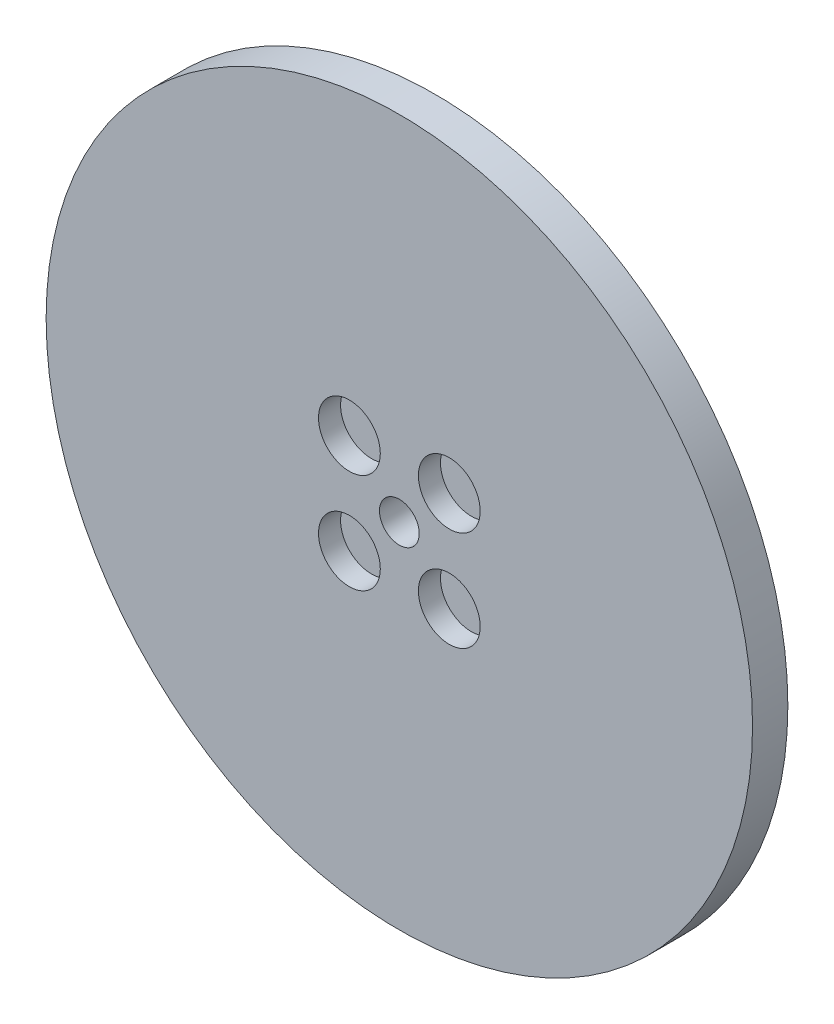
ISO-10303-21;
HEADER;
FILE_DESCRIPTION(('STEP AP214'),'2;1');
FILE_NAME('part.step','',(''),(''),'','','');
FILE_SCHEMA(('AUTOMOTIVE_DESIGN { 1 0 10303 214 1 1 1 1 }'));
ENDSEC;
DATA;
#1=APPLICATION_CONTEXT('core data for automotive mechanical design processes');
#2=APPLICATION_PROTOCOL_DEFINITION('international standard','automotive_design',2000,#1);
#3=PRODUCT_CONTEXT('',#1,'mechanical');
#4=PRODUCT('Part','Part','',(#3));
#5=PRODUCT_RELATED_PRODUCT_CATEGORY('part','',(#4));
#6=PRODUCT_DEFINITION_FORMATION('','',#4);
#7=PRODUCT_DEFINITION_CONTEXT('part definition',#1,'design');
#8=PRODUCT_DEFINITION('design','',#6,#7);
#9=PRODUCT_DEFINITION_SHAPE('','',#8);
#10=(LENGTH_UNIT() NAMED_UNIT(*) SI_UNIT(.MILLI.,.METRE.));
#11=(NAMED_UNIT(*) PLANE_ANGLE_UNIT() SI_UNIT($,.RADIAN.));
#12=(NAMED_UNIT(*) SI_UNIT($,.STERADIAN.) SOLID_ANGLE_UNIT());
#13=UNCERTAINTY_MEASURE_WITH_UNIT(LENGTH_MEASURE(1.E-05),#10,'distance_accuracy_value','');
#14=(GEOMETRIC_REPRESENTATION_CONTEXT(3) GLOBAL_UNCERTAINTY_ASSIGNED_CONTEXT((#13)) GLOBAL_UNIT_ASSIGNED_CONTEXT((#10,
#11,#12)) REPRESENTATION_CONTEXT('',''));
#15=CARTESIAN_POINT('',(0.,0.,0.));
#16=DIRECTION('',(0.,0.,1.));
#17=DIRECTION('',(1.,0.,0.));
#18=AXIS2_PLACEMENT_3D('',#15,#16,#17);
#19=CARTESIAN_POINT('',(5.65599974191923,-5.65770862800566,8.));
#20=DIRECTION('',(0.,0.,-1.));
#21=DIRECTION('',(-1.,0.,0.));
#22=AXIS2_PLACEMENT_3D('',#19,#20,#21);
#23=CYLINDRICAL_SURFACE('',#22,1.5);
#24=CARTESIAN_POINT('',(5.65599974191923,-5.65770862800566,4.));
#25=DIRECTION('',(0.,0.,1.));
#26=DIRECTION('',(1.,0.,0.));
#27=AXIS2_PLACEMENT_3D('',#24,#25,#26);
#28=CIRCLE('',#27,1.5);
#29=CARTESIAN_POINT('',(7.15599974191923,-5.65770862800566,4.));
#30=VERTEX_POINT('',#29);
#31=EDGE_CURVE('E159',#30,#30,#28,.T.);
#32=ORIENTED_EDGE('',*,*,#31,.F.);
#33=EDGE_LOOP('',(#32));
#34=FACE_BOUND('',#33,.T.);
#35=CARTESIAN_POINT('',(5.65599974191923,-5.65770862800566,5.3));
#36=DIRECTION('',(0.,0.,1.));
#37=DIRECTION('',(1.,0.,0.));
#38=AXIS2_PLACEMENT_3D('',#35,#36,#37);
#39=CIRCLE('',#38,1.5);
#40=CARTESIAN_POINT('',(7.15599974191923,-5.65770862800566,5.3));
#41=VERTEX_POINT('',#40);
#42=EDGE_CURVE('E43',#41,#41,#39,.T.);
#43=ORIENTED_EDGE('',*,*,#42,.T.);
#44=EDGE_LOOP('',(#43));
#45=FACE_BOUND('',#44,.T.);
#46=ADVANCED_FACE('F39',(#34,#45),#23,.F.);
#47=CARTESIAN_POINT('',(-5.65599974191923,-5.65770862800566,8.));
#48=DIRECTION('',(0.,0.,-1.));
#49=DIRECTION('',(-1.,0.,0.));
#50=AXIS2_PLACEMENT_3D('',#47,#48,#49);
#51=CYLINDRICAL_SURFACE('',#50,1.5);
#52=CARTESIAN_POINT('',(-5.65599974191923,-5.65770862800566,4.));
#53=DIRECTION('',(0.,0.,1.));
#54=DIRECTION('',(1.,0.,0.));
#55=AXIS2_PLACEMENT_3D('',#52,#53,#54);
#56=CIRCLE('',#55,1.5);
#57=CARTESIAN_POINT('',(-4.15599974191923,-5.65770862800566,4.));
#58=VERTEX_POINT('',#57);
#59=EDGE_CURVE('E156',#58,#58,#56,.T.);
#60=ORIENTED_EDGE('',*,*,#59,.F.);
#61=EDGE_LOOP('',(#60));
#62=FACE_BOUND('',#61,.T.);
#63=CARTESIAN_POINT('',(-5.65599974191923,-5.65770862800566,5.3));
#64=DIRECTION('',(0.,0.,1.));
#65=DIRECTION('',(1.,0.,0.));
#66=AXIS2_PLACEMENT_3D('',#63,#64,#65);
#67=CIRCLE('',#66,1.5);
#68=CARTESIAN_POINT('',(-4.15599974191923,-5.65770862800566,5.3));
#69=VERTEX_POINT('',#68);
#70=EDGE_CURVE('E63',#69,#69,#67,.T.);
#71=ORIENTED_EDGE('',*,*,#70,.T.);
#72=EDGE_LOOP('',(#71));
#73=FACE_BOUND('',#72,.T.);
#74=ADVANCED_FACE('F82',(#62,#73),#51,.F.);
#75=CARTESIAN_POINT('',(5.65599974191923,5.65770862800566,8.));
#76=DIRECTION('',(0.,0.,-1.));
#77=DIRECTION('',(-1.,0.,0.));
#78=AXIS2_PLACEMENT_3D('',#75,#76,#77);
#79=CYLINDRICAL_SURFACE('',#78,1.5);
#80=CARTESIAN_POINT('',(5.65599974191923,5.65770862800566,4.));
#81=DIRECTION('',(0.,0.,1.));
#82=DIRECTION('',(1.,0.,0.));
#83=AXIS2_PLACEMENT_3D('',#80,#81,#82);
#84=CIRCLE('',#83,1.5);
#85=CARTESIAN_POINT('',(7.15599974191923,5.65770862800566,4.));
#86=VERTEX_POINT('',#85);
#87=EDGE_CURVE('E162',#86,#86,#84,.T.);
#88=ORIENTED_EDGE('',*,*,#87,.F.);
#89=EDGE_LOOP('',(#88));
#90=FACE_BOUND('',#89,.T.);
#91=CARTESIAN_POINT('',(5.65599974191923,5.65770862800566,5.3));
#92=DIRECTION('',(0.,0.,1.));
#93=DIRECTION('',(1.,0.,0.));
#94=AXIS2_PLACEMENT_3D('',#91,#92,#93);
#95=CIRCLE('',#94,1.5);
#96=CARTESIAN_POINT('',(7.15599974191923,5.65770862800566,5.3));
#97=VERTEX_POINT('',#96);
#98=EDGE_CURVE('E61',#97,#97,#95,.T.);
#99=ORIENTED_EDGE('',*,*,#98,.T.);
#100=EDGE_LOOP('',(#99));
#101=FACE_BOUND('',#100,.T.);
#102=ADVANCED_FACE('F89',(#90,#101),#79,.F.);
#103=CARTESIAN_POINT('',(-5.65599974191923,5.65770862800566,8.));
#104=DIRECTION('',(0.,0.,-1.));
#105=DIRECTION('',(-1.,0.,0.));
#106=AXIS2_PLACEMENT_3D('',#103,#104,#105);
#107=CYLINDRICAL_SURFACE('',#106,1.5);
#108=CARTESIAN_POINT('',(-5.65599974191923,5.65770862800566,4.));
#109=DIRECTION('',(0.,0.,1.));
#110=DIRECTION('',(1.,0.,0.));
#111=AXIS2_PLACEMENT_3D('',#108,#109,#110);
#112=CIRCLE('',#111,1.5);
#113=CARTESIAN_POINT('',(-4.15599974191923,5.65770862800566,4.));
#114=VERTEX_POINT('',#113);
#115=EDGE_CURVE('E151',#114,#114,#112,.T.);
#116=ORIENTED_EDGE('',*,*,#115,.F.);
#117=EDGE_LOOP('',(#116));
#118=FACE_BOUND('',#117,.T.);
#119=CARTESIAN_POINT('',(-5.65599974191923,5.65770862800566,5.3));
#120=DIRECTION('',(0.,0.,1.));
#121=DIRECTION('',(1.,0.,0.));
#122=AXIS2_PLACEMENT_3D('',#119,#120,#121);
#123=CIRCLE('',#122,1.5);
#124=CARTESIAN_POINT('',(-4.15599974191923,5.65770862800566,5.3));
#125=VERTEX_POINT('',#124);
#126=EDGE_CURVE('E57',#125,#125,#123,.T.);
#127=ORIENTED_EDGE('',*,*,#126,.T.);
#128=EDGE_LOOP('',(#127));
#129=FACE_BOUND('',#128,.T.);
#130=ADVANCED_FACE('F96',(#118,#129),#107,.F.);
#131=CARTESIAN_POINT('',(0.,0.,0.));
#132=DIRECTION('',(0.,0.,1.));
#133=DIRECTION('',(1.,0.,0.));
#134=AXIS2_PLACEMENT_3D('',#131,#132,#133);
#135=PLANE('',#134);
#136=CARTESIAN_POINT('',(20.,0.,0.));
#137=DIRECTION('',(0.,0.,-1.));
#138=DIRECTION('',(-1.,0.,0.));
#139=AXIS2_PLACEMENT_3D('',#136,#137,#138);
#140=CIRCLE('',#139,5.15);
#141=CARTESIAN_POINT('',(14.85,0.,0.));
#142=VERTEX_POINT('',#141);
#143=EDGE_CURVE('E60',#142,#142,#140,.T.);
#144=ORIENTED_EDGE('',*,*,#143,.F.);
#145=EDGE_LOOP('',(#144));
#146=FACE_BOUND('',#145,.T.);
#147=CARTESIAN_POINT('',(0.,0.,0.));
#148=DIRECTION('',(0.,0.,1.));
#149=DIRECTION('',(1.,0.,0.));
#150=AXIS2_PLACEMENT_3D('',#147,#148,#149);
#151=CIRCLE('',#150,30.);
#152=CARTESIAN_POINT('',(30.,0.,0.));
#153=VERTEX_POINT('',#152);
#154=EDGE_CURVE('E47',#153,#153,#151,.T.);
#155=ORIENTED_EDGE('',*,*,#154,.F.);
#156=EDGE_LOOP('',(#155));
#157=FACE_BOUND('',#156,.T.);
#158=CARTESIAN_POINT('',(0.,0.,0.));
#159=DIRECTION('',(0.,0.,1.));
#160=DIRECTION('',(1.,0.,0.));
#161=AXIS2_PLACEMENT_3D('',#158,#159,#160);
#162=CIRCLE('',#161,12.5);
#163=CARTESIAN_POINT('',(12.5,0.,0.));
#164=VERTEX_POINT('',#163);
#165=EDGE_CURVE('E52',#164,#164,#162,.T.);
#166=ORIENTED_EDGE('',*,*,#165,.T.);
#167=EDGE_LOOP('',(#166));
#168=FACE_BOUND('',#167,.T.);
#169=ADVANCED_FACE('F99',(#146,#157,#168),#135,.F.);
#170=CARTESIAN_POINT('',(0.,0.,4.));
#171=DIRECTION('',(0.,0.,-1.));
#172=DIRECTION('',(-1.,0.,0.));
#173=AXIS2_PLACEMENT_3D('',#170,#171,#172);
#174=CYLINDRICAL_SURFACE('',#173,30.);
#175=CARTESIAN_POINT('',(0.,0.,4.));
#176=DIRECTION('',(0.,0.,1.));
#177=DIRECTION('',(1.,0.,0.));
#178=AXIS2_PLACEMENT_3D('',#175,#176,#177);
#179=CIRCLE('',#178,30.);
#180=CARTESIAN_POINT('',(30.,0.,4.));
#181=VERTEX_POINT('',#180);
#182=EDGE_CURVE('E10',#181,#181,#179,.T.);
#183=ORIENTED_EDGE('',*,*,#182,.F.);
#184=EDGE_LOOP('',(#183));
#185=FACE_BOUND('',#184,.T.);
#186=ORIENTED_EDGE('',*,*,#154,.T.);
#187=EDGE_LOOP('',(#186));
#188=FACE_BOUND('',#187,.T.);
#189=ADVANCED_FACE('F41',(#185,#188),#174,.T.);
#190=CARTESIAN_POINT('',(0.,0.,4.));
#191=DIRECTION('',(0.,0.,-1.));
#192=DIRECTION('',(-1.,0.,0.));
#193=AXIS2_PLACEMENT_3D('',#190,#191,#192);
#194=CYLINDRICAL_SURFACE('',#193,12.5);
#195=CARTESIAN_POINT('',(0.,0.,4.));
#196=DIRECTION('',(0.,0.,1.));
#197=DIRECTION('',(1.,0.,0.));
#198=AXIS2_PLACEMENT_3D('',#195,#196,#197);
#199=CIRCLE('',#198,12.5);
#200=CARTESIAN_POINT('',(12.5,0.,4.));
#201=VERTEX_POINT('',#200);
#202=EDGE_CURVE('E137',#201,#201,#199,.T.);
#203=ORIENTED_EDGE('',*,*,#202,.T.);
#204=EDGE_LOOP('',(#203));
#205=FACE_BOUND('',#204,.T.);
#206=ORIENTED_EDGE('',*,*,#165,.F.);
#207=EDGE_LOOP('',(#206));
#208=FACE_BOUND('',#207,.T.);
#209=ADVANCED_FACE('F118',(#205,#208),#194,.F.);
#210=CARTESIAN_POINT('',(0.,0.,4.));
#211=DIRECTION('',(0.,0.,1.));
#212=DIRECTION('',(1.,0.,0.));
#213=AXIS2_PLACEMENT_3D('',#210,#211,#212);
#214=PLANE('',#213);
#215=ORIENTED_EDGE('',*,*,#87,.T.);
#216=EDGE_LOOP('',(#215));
#217=FACE_BOUND('',#216,.T.);
#218=ORIENTED_EDGE('',*,*,#31,.T.);
#219=EDGE_LOOP('',(#218));
#220=FACE_BOUND('',#219,.T.);
#221=ORIENTED_EDGE('',*,*,#59,.T.);
#222=EDGE_LOOP('',(#221));
#223=FACE_BOUND('',#222,.T.);
#224=ORIENTED_EDGE('',*,*,#115,.T.);
#225=EDGE_LOOP('',(#224));
#226=FACE_BOUND('',#225,.T.);
#227=CARTESIAN_POINT('',(0.,0.,4.));
#228=DIRECTION('',(0.,0.,1.));
#229=DIRECTION('',(1.,0.,0.));
#230=AXIS2_PLACEMENT_3D('',#227,#228,#229);
#231=CIRCLE('',#230,2.25);
#232=CARTESIAN_POINT('',(2.25,0.,4.));
#233=VERTEX_POINT('',#232);
#234=EDGE_CURVE('E148',#233,#233,#231,.T.);
#235=ORIENTED_EDGE('',*,*,#234,.T.);
#236=EDGE_LOOP('',(#235));
#237=FACE_BOUND('',#236,.T.);
#238=ORIENTED_EDGE('',*,*,#202,.F.);
#239=EDGE_LOOP('',(#238));
#240=FACE_BOUND('',#239,.T.);
#241=ADVANCED_FACE('F111',(#217,#220,#223,#226,#237,#240),#214,.F.);
#242=CARTESIAN_POINT('',(0.,0.,8.));
#243=DIRECTION('',(0.,0.,1.));
#244=DIRECTION('',(1.,0.,0.));
#245=AXIS2_PLACEMENT_3D('',#242,#243,#244);
#246=PLANE('',#245);
#247=CARTESIAN_POINT('',(-5.65599974191923,-5.65770862800566,8.));
#248=DIRECTION('',(0.,0.,1.));
#249=DIRECTION('',(1.,0.,0.));
#250=AXIS2_PLACEMENT_3D('',#247,#248,#249);
#251=CIRCLE('',#250,3.5);
#252=CARTESIAN_POINT('',(-2.15599974191923,-5.65770862800566,8.));
#253=VERTEX_POINT('',#252);
#254=EDGE_CURVE('E175',#253,#253,#251,.T.);
#255=ORIENTED_EDGE('',*,*,#254,.F.);
#256=EDGE_LOOP('',(#255));
#257=FACE_BOUND('',#256,.T.);
#258=CARTESIAN_POINT('',(5.65599974191923,-5.65770862800566,8.));
#259=DIRECTION('',(0.,0.,1.));
#260=DIRECTION('',(1.,0.,0.));
#261=AXIS2_PLACEMENT_3D('',#258,#259,#260);
#262=CIRCLE('',#261,3.5);
#263=CARTESIAN_POINT('',(9.15599974191923,-5.65770862800566,8.));
#264=VERTEX_POINT('',#263);
#265=EDGE_CURVE('E182',#264,#264,#262,.T.);
#266=ORIENTED_EDGE('',*,*,#265,.F.);
#267=EDGE_LOOP('',(#266));
#268=FACE_BOUND('',#267,.T.);
#269=CARTESIAN_POINT('',(5.65599974191923,5.65770862800566,8.));
#270=DIRECTION('',(0.,0.,1.));
#271=DIRECTION('',(1.,0.,0.));
#272=AXIS2_PLACEMENT_3D('',#269,#270,#271);
#273=CIRCLE('',#272,3.5);
#274=CARTESIAN_POINT('',(9.15599974191923,5.65770862800566,8.));
#275=VERTEX_POINT('',#274);
#276=EDGE_CURVE('E169',#275,#275,#273,.T.);
#277=ORIENTED_EDGE('',*,*,#276,.F.);
#278=EDGE_LOOP('',(#277));
#279=FACE_BOUND('',#278,.T.);
#280=CARTESIAN_POINT('',(-5.65599974191923,5.65770862800566,8.));
#281=DIRECTION('',(0.,0.,1.));
#282=DIRECTION('',(1.,0.,0.));
#283=AXIS2_PLACEMENT_3D('',#280,#281,#282);
#284=CIRCLE('',#283,3.5);
#285=CARTESIAN_POINT('',(-2.15599974191923,5.65770862800566,8.));
#286=VERTEX_POINT('',#285);
#287=EDGE_CURVE('E166',#286,#286,#284,.T.);
#288=ORIENTED_EDGE('',*,*,#287,.F.);
#289=EDGE_LOOP('',(#288));
#290=FACE_BOUND('',#289,.T.);
#291=CARTESIAN_POINT('',(0.,0.,8.));
#292=DIRECTION('',(0.,0.,1.));
#293=DIRECTION('',(1.,0.,0.));
#294=AXIS2_PLACEMENT_3D('',#291,#292,#293);
#295=CIRCLE('',#294,40.);
#296=CARTESIAN_POINT('',(40.,0.,8.));
#297=VERTEX_POINT('',#296);
#298=EDGE_CURVE('E139',#297,#297,#295,.T.);
#299=ORIENTED_EDGE('',*,*,#298,.T.);
#300=EDGE_LOOP('',(#299));
#301=FACE_BOUND('',#300,.T.);
#302=CARTESIAN_POINT('',(0.,0.,8.));
#303=DIRECTION('',(0.,0.,1.));
#304=DIRECTION('',(1.,0.,0.));
#305=AXIS2_PLACEMENT_3D('',#302,#303,#304);
#306=CIRCLE('',#305,2.25);
#307=CARTESIAN_POINT('',(2.25,0.,8.));
#308=VERTEX_POINT('',#307);
#309=EDGE_CURVE('E146',#308,#308,#306,.T.);
#310=ORIENTED_EDGE('',*,*,#309,.F.);
#311=EDGE_LOOP('',(#310));
#312=FACE_BOUND('',#311,.T.);
#313=ADVANCED_FACE('F107',(#257,#268,#279,#290,#301,#312),#246,.T.);
#314=ORIENTED_EDGE('',*,*,#182,.T.);
#315=EDGE_LOOP('',(#314));
#316=FACE_BOUND('',#315,.T.);
#317=CARTESIAN_POINT('',(0.,0.,4.));
#318=DIRECTION('',(0.,0.,1.));
#319=DIRECTION('',(1.,0.,0.));
#320=AXIS2_PLACEMENT_3D('',#317,#318,#319);
#321=CIRCLE('',#320,40.);
#322=CARTESIAN_POINT('',(40.,0.,4.));
#323=VERTEX_POINT('',#322);
#324=EDGE_CURVE('E142',#323,#323,#321,.T.);
#325=ORIENTED_EDGE('',*,*,#324,.F.);
#326=EDGE_LOOP('',(#325));
#327=FACE_BOUND('',#326,.T.);
#328=ADVANCED_FACE('F110',(#316,#327),#214,.F.);
#329=CARTESIAN_POINT('',(0.,0.,8.));
#330=DIRECTION('',(0.,0.,-1.));
#331=DIRECTION('',(-1.,0.,0.));
#332=AXIS2_PLACEMENT_3D('',#329,#330,#331);
#333=CYLINDRICAL_SURFACE('',#332,40.);
#334=ORIENTED_EDGE('',*,*,#298,.F.);
#335=EDGE_LOOP('',(#334));
#336=FACE_BOUND('',#335,.T.);
#337=ORIENTED_EDGE('',*,*,#324,.T.);
#338=EDGE_LOOP('',(#337));
#339=FACE_BOUND('',#338,.T.);
#340=ADVANCED_FACE('F105',(#336,#339),#333,.T.);
#341=CARTESIAN_POINT('',(0.,0.,8.));
#342=DIRECTION('',(0.,0.,-1.));
#343=DIRECTION('',(-1.,0.,0.));
#344=AXIS2_PLACEMENT_3D('',#341,#342,#343);
#345=CYLINDRICAL_SURFACE('',#344,2.25);
#346=ORIENTED_EDGE('',*,*,#309,.T.);
#347=EDGE_LOOP('',(#346));
#348=FACE_BOUND('',#347,.T.);
#349=ORIENTED_EDGE('',*,*,#234,.F.);
#350=EDGE_LOOP('',(#349));
#351=FACE_BOUND('',#350,.T.);
#352=ADVANCED_FACE('F101',(#348,#351),#345,.F.);
#353=CARTESIAN_POINT('',(5.65599974191923,5.65770862800566,5.5));
#354=DIRECTION('',(0.,0.,1.));
#355=DIRECTION('',(1.,0.,0.));
#356=AXIS2_PLACEMENT_3D('',#353,#354,#355);
#357=CYLINDRICAL_SURFACE('',#356,3.5);
#358=CARTESIAN_POINT('',(5.65599974191923,5.65770862800566,5.5));
#359=DIRECTION('',(0.,0.,1.));
#360=DIRECTION('',(1.,0.,0.));
#361=AXIS2_PLACEMENT_3D('',#358,#359,#360);
#362=CIRCLE('',#361,3.5);
#363=CARTESIAN_POINT('',(9.15599974191923,5.65770862800566,5.5));
#364=VERTEX_POINT('',#363);
#365=EDGE_CURVE('E185',#364,#364,#362,.T.);
#366=ORIENTED_EDGE('',*,*,#365,.F.);
#367=EDGE_LOOP('',(#366));
#368=FACE_BOUND('',#367,.T.);
#369=ORIENTED_EDGE('',*,*,#276,.T.);
#370=EDGE_LOOP('',(#369));
#371=FACE_BOUND('',#370,.T.);
#372=ADVANCED_FACE('F104',(#368,#371),#357,.F.);
#373=CARTESIAN_POINT('',(5.65599974191923,5.65770862800566,5.5));
#374=DIRECTION('',(0.,0.,1.));
#375=DIRECTION('',(1.,0.,0.));
#376=AXIS2_PLACEMENT_3D('',#373,#374,#375);
#377=PLANE('',#376);
#378=ORIENTED_EDGE('',*,*,#365,.T.);
#379=EDGE_LOOP('',(#378));
#380=FACE_BOUND('',#379,.T.);
#381=ADVANCED_FACE('F212',(#380),#377,.T.);
#382=CARTESIAN_POINT('',(5.65599974191923,-5.65770862800566,5.5));
#383=DIRECTION('',(0.,0.,1.));
#384=DIRECTION('',(1.,0.,0.));
#385=AXIS2_PLACEMENT_3D('',#382,#383,#384);
#386=CYLINDRICAL_SURFACE('',#385,3.5);
#387=CARTESIAN_POINT('',(5.65599974191923,-5.65770862800566,5.5));
#388=DIRECTION('',(0.,0.,1.));
#389=DIRECTION('',(1.,0.,0.));
#390=AXIS2_PLACEMENT_3D('',#387,#388,#389);
#391=CIRCLE('',#390,3.5);
#392=CARTESIAN_POINT('',(9.15599974191923,-5.65770862800566,5.5));
#393=VERTEX_POINT('',#392);
#394=EDGE_CURVE('E179',#393,#393,#391,.T.);
#395=ORIENTED_EDGE('',*,*,#394,.F.);
#396=EDGE_LOOP('',(#395));
#397=FACE_BOUND('',#396,.T.);
#398=ORIENTED_EDGE('',*,*,#265,.T.);
#399=EDGE_LOOP('',(#398));
#400=FACE_BOUND('',#399,.T.);
#401=ADVANCED_FACE('F216',(#397,#400),#386,.F.);
#402=CARTESIAN_POINT('',(5.65599974191923,-5.65770862800566,5.5));
#403=DIRECTION('',(0.,0.,1.));
#404=DIRECTION('',(1.,0.,0.));
#405=AXIS2_PLACEMENT_3D('',#402,#403,#404);
#406=PLANE('',#405);
#407=ORIENTED_EDGE('',*,*,#394,.T.);
#408=EDGE_LOOP('',(#407));
#409=FACE_BOUND('',#408,.T.);
#410=ADVANCED_FACE('F220',(#409),#406,.T.);
#411=CARTESIAN_POINT('',(-5.65599974191923,-5.65770862800566,5.5));
#412=DIRECTION('',(0.,0.,1.));
#413=DIRECTION('',(1.,0.,0.));
#414=AXIS2_PLACEMENT_3D('',#411,#412,#413);
#415=CYLINDRICAL_SURFACE('',#414,3.5);
#416=CARTESIAN_POINT('',(-5.65599974191923,-5.65770862800566,5.5));
#417=DIRECTION('',(0.,0.,1.));
#418=DIRECTION('',(1.,0.,0.));
#419=AXIS2_PLACEMENT_3D('',#416,#417,#418);
#420=CIRCLE('',#419,3.5);
#421=CARTESIAN_POINT('',(-2.15599974191923,-5.65770862800566,5.5));
#422=VERTEX_POINT('',#421);
#423=EDGE_CURVE('E172',#422,#422,#420,.T.);
#424=ORIENTED_EDGE('',*,*,#423,.F.);
#425=EDGE_LOOP('',(#424));
#426=FACE_BOUND('',#425,.T.);
#427=ORIENTED_EDGE('',*,*,#254,.T.);
#428=EDGE_LOOP('',(#427));
#429=FACE_BOUND('',#428,.T.);
#430=ADVANCED_FACE('F224',(#426,#429),#415,.F.);
#431=CARTESIAN_POINT('',(-5.65599974191923,-5.65770862800566,5.5));
#432=DIRECTION('',(0.,0.,1.));
#433=DIRECTION('',(1.,0.,0.));
#434=AXIS2_PLACEMENT_3D('',#431,#432,#433);
#435=PLANE('',#434);
#436=ORIENTED_EDGE('',*,*,#423,.T.);
#437=EDGE_LOOP('',(#436));
#438=FACE_BOUND('',#437,.T.);
#439=ADVANCED_FACE('F228',(#438),#435,.T.);
#440=CARTESIAN_POINT('',(-5.65599974191923,5.65770862800566,5.5));
#441=DIRECTION('',(0.,0.,1.));
#442=DIRECTION('',(1.,0.,0.));
#443=AXIS2_PLACEMENT_3D('',#440,#441,#442);
#444=CYLINDRICAL_SURFACE('',#443,3.5);
#445=CARTESIAN_POINT('',(-5.65599974191923,5.65770862800566,5.5));
#446=DIRECTION('',(0.,0.,1.));
#447=DIRECTION('',(1.,0.,0.));
#448=AXIS2_PLACEMENT_3D('',#445,#446,#447);
#449=CIRCLE('',#448,3.5);
#450=CARTESIAN_POINT('',(-2.15599974191923,5.65770862800566,5.5));
#451=VERTEX_POINT('',#450);
#452=EDGE_CURVE('E165',#451,#451,#449,.T.);
#453=ORIENTED_EDGE('',*,*,#452,.F.);
#454=EDGE_LOOP('',(#453));
#455=FACE_BOUND('',#454,.T.);
#456=ORIENTED_EDGE('',*,*,#287,.T.);
#457=EDGE_LOOP('',(#456));
#458=FACE_BOUND('',#457,.T.);
#459=ADVANCED_FACE('F205',(#455,#458),#444,.F.);
#460=CARTESIAN_POINT('',(-5.65599974191923,5.65770862800566,5.5));
#461=DIRECTION('',(0.,0.,1.));
#462=DIRECTION('',(1.,0.,0.));
#463=AXIS2_PLACEMENT_3D('',#460,#461,#462);
#464=PLANE('',#463);
#465=ORIENTED_EDGE('',*,*,#452,.T.);
#466=EDGE_LOOP('',(#465));
#467=FACE_BOUND('',#466,.T.);
#468=ADVANCED_FACE('F198',(#467),#464,.T.);
#469=CARTESIAN_POINT('',(20.,0.,4.));
#470=DIRECTION('',(0.,0.,-1.));
#471=DIRECTION('',(-1.,0.,0.));
#472=AXIS2_PLACEMENT_3D('',#469,#470,#471);
#473=CYLINDRICAL_SURFACE('',#472,5.15);
#474=CARTESIAN_POINT('',(20.,0.,4.));
#475=DIRECTION('',(0.,0.,-1.));
#476=DIRECTION('',(-1.,0.,0.));
#477=AXIS2_PLACEMENT_3D('',#474,#475,#476);
#478=CIRCLE('',#477,5.15);
#479=CARTESIAN_POINT('',(14.85,0.,4.));
#480=VERTEX_POINT('',#479);
#481=EDGE_CURVE('E176',#480,#480,#478,.T.);
#482=ORIENTED_EDGE('',*,*,#481,.F.);
#483=EDGE_LOOP('',(#482));
#484=FACE_BOUND('',#483,.T.);
#485=ORIENTED_EDGE('',*,*,#143,.T.);
#486=EDGE_LOOP('',(#485));
#487=FACE_BOUND('',#486,.T.);
#488=ADVANCED_FACE('F196',(#484,#487),#473,.F.);
#489=CARTESIAN_POINT('',(20.,0.,4.));
#490=DIRECTION('',(0.,0.,-1.));
#491=DIRECTION('',(-1.,0.,0.));
#492=AXIS2_PLACEMENT_3D('',#489,#490,#491);
#493=PLANE('',#492);
#494=ORIENTED_EDGE('',*,*,#481,.T.);
#495=EDGE_LOOP('',(#494));
#496=FACE_BOUND('',#495,.T.);
#497=ADVANCED_FACE('F194',(#496),#493,.T.);
#498=CARTESIAN_POINT('',(-5.65599974191923,5.65770862800566,5.3));
#499=DIRECTION('',(0.,0.,1.));
#500=DIRECTION('',(1.,0.,0.));
#501=AXIS2_PLACEMENT_3D('',#498,#499,#500);
#502=PLANE('',#501);
#503=ORIENTED_EDGE('',*,*,#126,.F.);
#504=EDGE_LOOP('',(#503));
#505=FACE_BOUND('',#504,.T.);
#506=ADVANCED_FACE('F202',(#505),#502,.F.);
#507=CARTESIAN_POINT('',(5.65599974191923,5.65770862800566,5.3));
#508=DIRECTION('',(0.,0.,1.));
#509=DIRECTION('',(1.,0.,0.));
#510=AXIS2_PLACEMENT_3D('',#507,#508,#509);
#511=PLANE('',#510);
#512=ORIENTED_EDGE('',*,*,#98,.F.);
#513=EDGE_LOOP('',(#512));
#514=FACE_BOUND('',#513,.T.);
#515=ADVANCED_FACE('F78',(#514),#511,.F.);
#516=CARTESIAN_POINT('',(-5.65599974191923,-5.65770862800566,5.3));
#517=DIRECTION('',(0.,0.,1.));
#518=DIRECTION('',(1.,0.,0.));
#519=AXIS2_PLACEMENT_3D('',#516,#517,#518);
#520=PLANE('',#519);
#521=ORIENTED_EDGE('',*,*,#70,.F.);
#522=EDGE_LOOP('',(#521));
#523=FACE_BOUND('',#522,.T.);
#524=ADVANCED_FACE('F73',(#523),#520,.F.);
#525=CARTESIAN_POINT('',(5.65599974191923,-5.65770862800566,5.3));
#526=DIRECTION('',(0.,0.,1.));
#527=DIRECTION('',(1.,0.,0.));
#528=AXIS2_PLACEMENT_3D('',#525,#526,#527);
#529=PLANE('',#528);
#530=ORIENTED_EDGE('',*,*,#42,.F.);
#531=EDGE_LOOP('',(#530));
#532=FACE_BOUND('',#531,.T.);
#533=ADVANCED_FACE('F71',(#532),#529,.F.);
#534=CLOSED_SHELL('',(#46,#74,#102,#130,#169,#189,#209,#241,#313,#328,#340,#352,#372,#381,#401,
#410,#430,#439,#459,#468,#488,#497,#506,#515,#524,#533));
#535=MANIFOLD_SOLID_BREP('B2',#534);
#536=ADVANCED_BREP_SHAPE_REPRESENTATION('',(#18,#535),#14);
#537=SHAPE_DEFINITION_REPRESENTATION(#9,#536);
ENDSEC;
END-ISO-10303-21;
